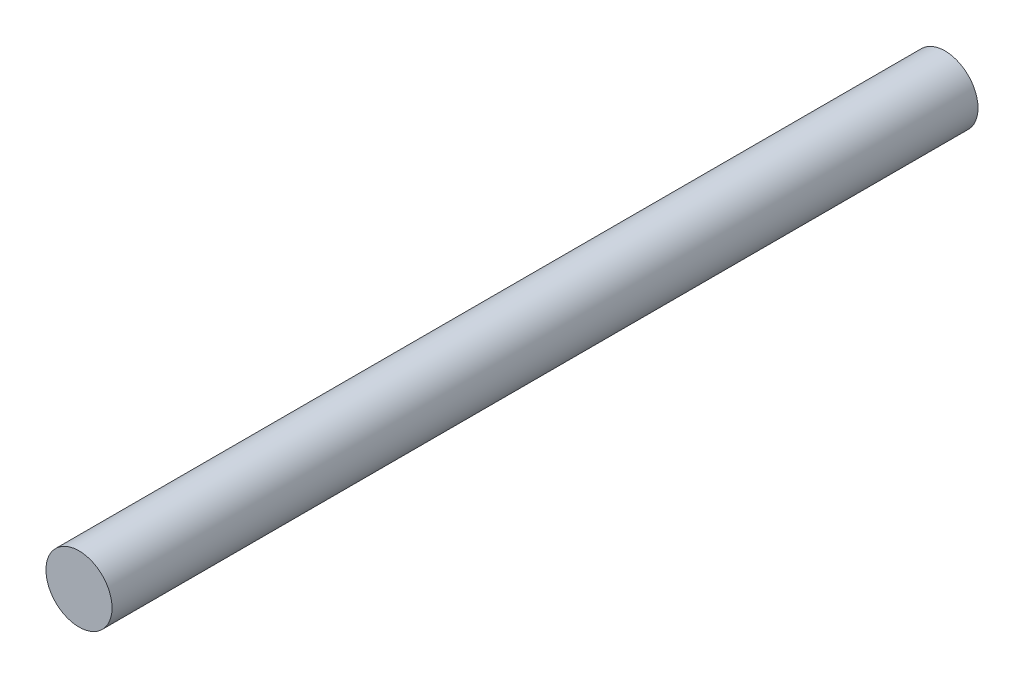
ISO-10303-21;
HEADER;
FILE_DESCRIPTION(('STEP AP214'),'2;1');
FILE_NAME('part.step','',(''),(''),'','','');
FILE_SCHEMA(('AUTOMOTIVE_DESIGN { 1 0 10303 214 1 1 1 1 }'));
ENDSEC;
DATA;
#1=APPLICATION_CONTEXT('core data for automotive mechanical design processes');
#2=APPLICATION_PROTOCOL_DEFINITION('international standard','automotive_design',2000,#1);
#3=PRODUCT_CONTEXT('',#1,'mechanical');
#4=PRODUCT('Part','Part','',(#3));
#5=PRODUCT_RELATED_PRODUCT_CATEGORY('part','',(#4));
#6=PRODUCT_DEFINITION_FORMATION('','',#4);
#7=PRODUCT_DEFINITION_CONTEXT('part definition',#1,'design');
#8=PRODUCT_DEFINITION('design','',#6,#7);
#9=PRODUCT_DEFINITION_SHAPE('','',#8);
#10=(LENGTH_UNIT() NAMED_UNIT(*) SI_UNIT(.MILLI.,.METRE.));
#11=(NAMED_UNIT(*) PLANE_ANGLE_UNIT() SI_UNIT($,.RADIAN.));
#12=(NAMED_UNIT(*) SI_UNIT($,.STERADIAN.) SOLID_ANGLE_UNIT());
#13=UNCERTAINTY_MEASURE_WITH_UNIT(LENGTH_MEASURE(1.E-05),#10,'distance_accuracy_value','');
#14=(GEOMETRIC_REPRESENTATION_CONTEXT(3) GLOBAL_UNCERTAINTY_ASSIGNED_CONTEXT((#13)) GLOBAL_UNIT_ASSIGNED_CONTEXT((#10,
#11,#12)) REPRESENTATION_CONTEXT('',''));
#15=CARTESIAN_POINT('',(0.,0.,0.));
#16=DIRECTION('',(0.,0.,1.));
#17=DIRECTION('',(1.,0.,0.));
#18=AXIS2_PLACEMENT_3D('',#15,#16,#17);
#19=CARTESIAN_POINT('',(0.,0.,262.));
#20=DIRECTION('',(0.,0.,-1.));
#21=DIRECTION('',(-1.,0.,0.));
#22=AXIS2_PLACEMENT_3D('',#19,#20,#21);
#23=CYLINDRICAL_SURFACE('',#22,10.);
#24=CARTESIAN_POINT('',(0.,0.,262.));
#25=DIRECTION('',(0.,0.,1.));
#26=DIRECTION('',(1.,0.,0.));
#27=AXIS2_PLACEMENT_3D('',#24,#25,#26);
#28=CIRCLE('',#27,10.);
#29=CARTESIAN_POINT('',(10.,0.,262.));
#30=VERTEX_POINT('',#29);
#31=EDGE_CURVE('E10',#30,#30,#28,.T.);
#32=ORIENTED_EDGE('',*,*,#31,.F.);
#33=EDGE_LOOP('',(#32));
#34=FACE_BOUND('',#33,.T.);
#35=CARTESIAN_POINT('',(0.,0.,0.));
#36=DIRECTION('',(0.,0.,1.));
#37=DIRECTION('',(1.,0.,0.));
#38=AXIS2_PLACEMENT_3D('',#35,#36,#37);
#39=CIRCLE('',#38,10.);
#40=CARTESIAN_POINT('',(10.,0.,0.));
#41=VERTEX_POINT('',#40);
#42=EDGE_CURVE('E44',#41,#41,#39,.T.);
#43=ORIENTED_EDGE('',*,*,#42,.T.);
#44=EDGE_LOOP('',(#43));
#45=FACE_BOUND('',#44,.T.);
#46=ADVANCED_FACE('F41',(#34,#45),#23,.T.);
#47=CARTESIAN_POINT('',(0.,0.,262.));
#48=DIRECTION('',(0.,0.,1.));
#49=DIRECTION('',(1.,0.,0.));
#50=AXIS2_PLACEMENT_3D('',#47,#48,#49);
#51=PLANE('',#50);
#52=ORIENTED_EDGE('',*,*,#31,.T.);
#53=EDGE_LOOP('',(#52));
#54=FACE_BOUND('',#53,.T.);
#55=ADVANCED_FACE('F58',(#54),#51,.T.);
#56=CARTESIAN_POINT('',(0.,0.,0.));
#57=DIRECTION('',(0.,0.,1.));
#58=DIRECTION('',(1.,0.,0.));
#59=AXIS2_PLACEMENT_3D('',#56,#57,#58);
#60=PLANE('',#59);
#61=ORIENTED_EDGE('',*,*,#42,.F.);
#62=EDGE_LOOP('',(#61));
#63=FACE_BOUND('',#62,.T.);
#64=ADVANCED_FACE('F56',(#63),#60,.F.);
#65=CLOSED_SHELL('',(#46,#55,#64));
#66=MANIFOLD_SOLID_BREP('B2',#65);
#67=ADVANCED_BREP_SHAPE_REPRESENTATION('',(#18,#66),#14);
#68=SHAPE_DEFINITION_REPRESENTATION(#9,#67);
ENDSEC;
END-ISO-10303-21;
